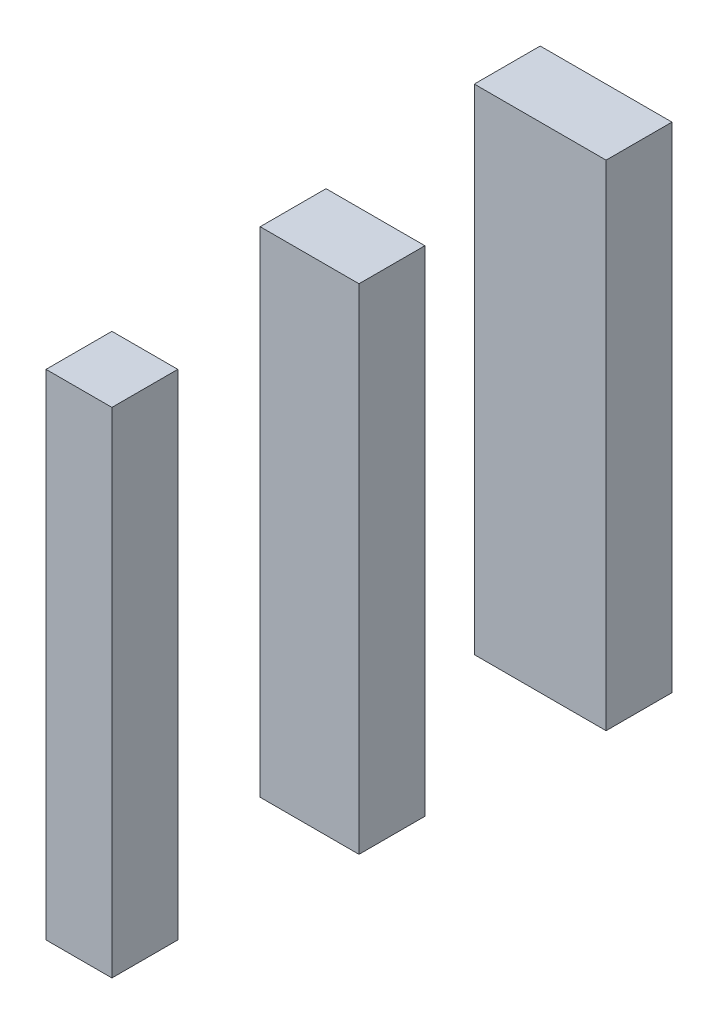
ISO-10303-21;
HEADER;
FILE_DESCRIPTION(('STEP AP214'),'2;1');
FILE_NAME('part.step','',(''),(''),'','','');
FILE_SCHEMA(('AUTOMOTIVE_DESIGN { 1 0 10303 214 1 1 1 1 }'));
ENDSEC;
DATA;
#1=APPLICATION_CONTEXT('core data for automotive mechanical design processes');
#2=APPLICATION_PROTOCOL_DEFINITION('international standard','automotive_design',2000,#1);
#3=PRODUCT_CONTEXT('',#1,'mechanical');
#4=PRODUCT('Part','Part','',(#3));
#5=PRODUCT_RELATED_PRODUCT_CATEGORY('part','',(#4));
#6=PRODUCT_DEFINITION_FORMATION('','',#4);
#7=PRODUCT_DEFINITION_CONTEXT('part definition',#1,'design');
#8=PRODUCT_DEFINITION('design','',#6,#7);
#9=PRODUCT_DEFINITION_SHAPE('','',#8);
#10=(LENGTH_UNIT() NAMED_UNIT(*) SI_UNIT(.MILLI.,.METRE.));
#11=(NAMED_UNIT(*) PLANE_ANGLE_UNIT() SI_UNIT($,.RADIAN.));
#12=(NAMED_UNIT(*) SI_UNIT($,.STERADIAN.) SOLID_ANGLE_UNIT());
#13=UNCERTAINTY_MEASURE_WITH_UNIT(LENGTH_MEASURE(1.E-05),#10,'distance_accuracy_value','');
#14=(GEOMETRIC_REPRESENTATION_CONTEXT(3) GLOBAL_UNCERTAINTY_ASSIGNED_CONTEXT((#13)) GLOBAL_UNIT_ASSIGNED_CONTEXT((#10,
#11,#12)) REPRESENTATION_CONTEXT('',''));
#15=CARTESIAN_POINT('',(0.,0.,0.));
#16=DIRECTION('',(0.,0.,1.));
#17=DIRECTION('',(1.,0.,0.));
#18=AXIS2_PLACEMENT_3D('',#15,#16,#17);
#19=CARTESIAN_POINT('',(-4.,31.,-16.));
#20=DIRECTION('',(1.,0.,0.));
#21=DIRECTION('',(0.,0.,-1.));
#22=AXIS2_PLACEMENT_3D('',#19,#20,#21);
#23=PLANE('',#22);
#24=DIRECTION('',(0.,0.,1.));
#25=VECTOR('',#24,1.);
#26=CARTESIAN_POINT('',(-4.,1.,-16.));
#27=LINE('',#26,#25);
#28=CARTESIAN_POINT('',(-4.,1.,-16.));
#29=VERTEX_POINT('',#28);
#30=CARTESIAN_POINT('',(-4.,1.,-12.));
#31=VERTEX_POINT('',#30);
#32=EDGE_CURVE('E107',#29,#31,#27,.T.);
#33=ORIENTED_EDGE('',*,*,#32,.T.);
#34=DIRECTION('',(0.,-1.,0.));
#35=VECTOR('',#34,1.);
#36=CARTESIAN_POINT('',(-4.,31.,-12.));
#37=LINE('',#36,#35);
#38=CARTESIAN_POINT('',(-4.,31.,-12.));
#39=VERTEX_POINT('',#38);
#40=EDGE_CURVE('E12',#39,#31,#37,.T.);
#41=ORIENTED_EDGE('',*,*,#40,.F.);
#42=DIRECTION('',(0.,0.,1.));
#43=VECTOR('',#42,1.);
#44=CARTESIAN_POINT('',(-4.,31.,-16.));
#45=LINE('',#44,#43);
#46=CARTESIAN_POINT('',(-4.,31.,-16.));
#47=VERTEX_POINT('',#46);
#48=EDGE_CURVE('E95',#47,#39,#45,.T.);
#49=ORIENTED_EDGE('',*,*,#48,.F.);
#50=DIRECTION('',(0.,-1.,0.));
#51=VECTOR('',#50,1.);
#52=CARTESIAN_POINT('',(-4.,31.,-16.));
#53=LINE('',#52,#51);
#54=EDGE_CURVE('E103',#47,#29,#53,.T.);
#55=ORIENTED_EDGE('',*,*,#54,.T.);
#56=EDGE_LOOP('',(#33,#41,#49,#55));
#57=FACE_BOUND('',#56,.T.);
#58=ADVANCED_FACE('F44',(#57),#23,.F.);
#59=CARTESIAN_POINT('',(-4.,31.,-12.));
#60=DIRECTION('',(0.,0.,-1.));
#61=DIRECTION('',(-1.,0.,0.));
#62=AXIS2_PLACEMENT_3D('',#59,#60,#61);
#63=PLANE('',#62);
#64=DIRECTION('',(1.,0.,0.));
#65=VECTOR('',#64,1.);
#66=CARTESIAN_POINT('',(-4.,1.,-12.));
#67=LINE('',#66,#65);
#68=CARTESIAN_POINT('',(4.,1.,-12.));
#69=VERTEX_POINT('',#68);
#70=EDGE_CURVE('E99',#31,#69,#67,.T.);
#71=ORIENTED_EDGE('',*,*,#70,.T.);
#72=DIRECTION('',(0.,-1.,0.));
#73=VECTOR('',#72,1.);
#74=CARTESIAN_POINT('',(4.,31.,-12.));
#75=LINE('',#74,#73);
#76=CARTESIAN_POINT('',(4.,31.,-12.));
#77=VERTEX_POINT('',#76);
#78=EDGE_CURVE('E52',#77,#69,#75,.T.);
#79=ORIENTED_EDGE('',*,*,#78,.F.);
#80=DIRECTION('',(1.,0.,0.));
#81=VECTOR('',#80,1.);
#82=CARTESIAN_POINT('',(-4.,31.,-12.));
#83=LINE('',#82,#81);
#84=EDGE_CURVE('E90',#39,#77,#83,.T.);
#85=ORIENTED_EDGE('',*,*,#84,.F.);
#86=ORIENTED_EDGE('',*,*,#40,.T.);
#87=EDGE_LOOP('',(#71,#79,#85,#86));
#88=FACE_BOUND('',#87,.T.);
#89=ADVANCED_FACE('F98',(#88),#63,.F.);
#90=CARTESIAN_POINT('',(4.,31.,-16.));
#91=DIRECTION('',(-1.,0.,0.));
#92=DIRECTION('',(0.,0.,1.));
#93=AXIS2_PLACEMENT_3D('',#90,#91,#92);
#94=PLANE('',#93);
#95=DIRECTION('',(0.,0.,-1.));
#96=VECTOR('',#95,1.);
#97=CARTESIAN_POINT('',(4.,1.,-16.));
#98=LINE('',#97,#96);
#99=CARTESIAN_POINT('',(4.,1.,-16.));
#100=VERTEX_POINT('',#99);
#101=EDGE_CURVE('E77',#69,#100,#98,.T.);
#102=ORIENTED_EDGE('',*,*,#101,.T.);
#103=DIRECTION('',(0.,-1.,0.));
#104=VECTOR('',#103,1.);
#105=CARTESIAN_POINT('',(4.,31.,-16.));
#106=LINE('',#105,#104);
#107=CARTESIAN_POINT('',(4.,31.,-16.));
#108=VERTEX_POINT('',#107);
#109=EDGE_CURVE('E100',#108,#100,#106,.T.);
#110=ORIENTED_EDGE('',*,*,#109,.F.);
#111=DIRECTION('',(0.,0.,-1.));
#112=VECTOR('',#111,1.);
#113=CARTESIAN_POINT('',(4.,31.,-16.));
#114=LINE('',#113,#112);
#115=EDGE_CURVE('E93',#77,#108,#114,.T.);
#116=ORIENTED_EDGE('',*,*,#115,.F.);
#117=ORIENTED_EDGE('',*,*,#78,.T.);
#118=EDGE_LOOP('',(#102,#110,#116,#117));
#119=FACE_BOUND('',#118,.T.);
#120=ADVANCED_FACE('F101',(#119),#94,.F.);
#121=CARTESIAN_POINT('',(-4.,31.,-16.));
#122=DIRECTION('',(0.,0.,1.));
#123=DIRECTION('',(1.,0.,0.));
#124=AXIS2_PLACEMENT_3D('',#121,#122,#123);
#125=PLANE('',#124);
#126=DIRECTION('',(-1.,0.,0.));
#127=VECTOR('',#126,1.);
#128=CARTESIAN_POINT('',(-4.,1.,-16.));
#129=LINE('',#128,#127);
#130=EDGE_CURVE('E83',#100,#29,#129,.T.);
#131=ORIENTED_EDGE('',*,*,#130,.T.);
#132=ORIENTED_EDGE('',*,*,#54,.F.);
#133=DIRECTION('',(-1.,0.,0.));
#134=VECTOR('',#133,1.);
#135=CARTESIAN_POINT('',(-4.,31.,-16.));
#136=LINE('',#135,#134);
#137=EDGE_CURVE('E60',#108,#47,#136,.T.);
#138=ORIENTED_EDGE('',*,*,#137,.F.);
#139=ORIENTED_EDGE('',*,*,#109,.T.);
#140=EDGE_LOOP('',(#131,#132,#138,#139));
#141=FACE_BOUND('',#140,.T.);
#142=ADVANCED_FACE('F114',(#141),#125,.F.);
#143=CARTESIAN_POINT('',(0.,31.,0.));
#144=DIRECTION('',(0.,1.,0.));
#145=DIRECTION('',(0.,0.,1.));
#146=AXIS2_PLACEMENT_3D('',#143,#144,#145);
#147=PLANE('',#146);
#148=ORIENTED_EDGE('',*,*,#48,.T.);
#149=ORIENTED_EDGE('',*,*,#84,.T.);
#150=ORIENTED_EDGE('',*,*,#115,.T.);
#151=ORIENTED_EDGE('',*,*,#137,.T.);
#152=EDGE_LOOP('',(#148,#149,#150,#151));
#153=FACE_BOUND('',#152,.T.);
#154=ADVANCED_FACE('F91',(#153),#147,.T.);
#155=CARTESIAN_POINT('',(0.,1.,0.));
#156=DIRECTION('',(0.,1.,0.));
#157=DIRECTION('',(0.,0.,1.));
#158=AXIS2_PLACEMENT_3D('',#155,#156,#157);
#159=PLANE('',#158);
#160=ORIENTED_EDGE('',*,*,#32,.F.);
#161=ORIENTED_EDGE('',*,*,#130,.F.);
#162=ORIENTED_EDGE('',*,*,#101,.F.);
#163=ORIENTED_EDGE('',*,*,#70,.F.);
#164=EDGE_LOOP('',(#160,#161,#162,#163));
#165=FACE_BOUND('',#164,.T.);
#166=ADVANCED_FACE('F117',(#165),#159,.F.);
#167=CLOSED_SHELL('',(#58,#89,#120,#142,#154,#166));
#168=MANIFOLD_SOLID_BREP('B2',#167);
#169=CARTESIAN_POINT('',(-3.,31.,-2.));
#170=DIRECTION('',(1.,0.,0.));
#171=DIRECTION('',(0.,0.,-1.));
#172=AXIS2_PLACEMENT_3D('',#169,#170,#171);
#173=PLANE('',#172);
#174=DIRECTION('',(0.,0.,1.));
#175=VECTOR('',#174,1.);
#176=CARTESIAN_POINT('',(-3.,1.,-2.));
#177=LINE('',#176,#175);
#178=CARTESIAN_POINT('',(-3.,1.,-2.));
#179=VERTEX_POINT('',#178);
#180=CARTESIAN_POINT('',(-3.,1.,2.));
#181=VERTEX_POINT('',#180);
#182=EDGE_CURVE('E240',#179,#181,#177,.T.);
#183=ORIENTED_EDGE('',*,*,#182,.T.);
#184=DIRECTION('',(0.,-1.,0.));
#185=VECTOR('',#184,1.);
#186=CARTESIAN_POINT('',(-3.,31.,2.));
#187=LINE('',#186,#185);
#188=CARTESIAN_POINT('',(-3.,31.,2.));
#189=VERTEX_POINT('',#188);
#190=EDGE_CURVE('E42',#189,#181,#187,.T.);
#191=ORIENTED_EDGE('',*,*,#190,.F.);
#192=DIRECTION('',(0.,0.,1.));
#193=VECTOR('',#192,1.);
#194=CARTESIAN_POINT('',(-3.,31.,-2.));
#195=LINE('',#194,#193);
#196=CARTESIAN_POINT('',(-3.,31.,-2.));
#197=VERTEX_POINT('',#196);
#198=EDGE_CURVE('E228',#197,#189,#195,.T.);
#199=ORIENTED_EDGE('',*,*,#198,.F.);
#200=DIRECTION('',(0.,-1.,0.));
#201=VECTOR('',#200,1.);
#202=CARTESIAN_POINT('',(-3.,31.,-2.));
#203=LINE('',#202,#201);
#204=EDGE_CURVE('E236',#197,#179,#203,.T.);
#205=ORIENTED_EDGE('',*,*,#204,.T.);
#206=EDGE_LOOP('',(#183,#191,#199,#205));
#207=FACE_BOUND('',#206,.T.);
#208=ADVANCED_FACE('F177',(#207),#173,.F.);
#209=CARTESIAN_POINT('',(-3.,31.,2.));
#210=DIRECTION('',(0.,0.,-1.));
#211=DIRECTION('',(-1.,0.,0.));
#212=AXIS2_PLACEMENT_3D('',#209,#210,#211);
#213=PLANE('',#212);
#214=DIRECTION('',(1.,0.,0.));
#215=VECTOR('',#214,1.);
#216=CARTESIAN_POINT('',(-3.,1.,2.));
#217=LINE('',#216,#215);
#218=CARTESIAN_POINT('',(3.,1.,2.));
#219=VERTEX_POINT('',#218);
#220=EDGE_CURVE('E232',#181,#219,#217,.T.);
#221=ORIENTED_EDGE('',*,*,#220,.T.);
#222=DIRECTION('',(0.,-1.,0.));
#223=VECTOR('',#222,1.);
#224=CARTESIAN_POINT('',(3.,31.,2.));
#225=LINE('',#224,#223);
#226=CARTESIAN_POINT('',(3.,31.,2.));
#227=VERTEX_POINT('',#226);
#228=EDGE_CURVE('E185',#227,#219,#225,.T.);
#229=ORIENTED_EDGE('',*,*,#228,.F.);
#230=DIRECTION('',(1.,0.,0.));
#231=VECTOR('',#230,1.);
#232=CARTESIAN_POINT('',(-3.,31.,2.));
#233=LINE('',#232,#231);
#234=EDGE_CURVE('E223',#189,#227,#233,.T.);
#235=ORIENTED_EDGE('',*,*,#234,.F.);
#236=ORIENTED_EDGE('',*,*,#190,.T.);
#237=EDGE_LOOP('',(#221,#229,#235,#236));
#238=FACE_BOUND('',#237,.T.);
#239=ADVANCED_FACE('F231',(#238),#213,.F.);
#240=CARTESIAN_POINT('',(3.,31.,-2.));
#241=DIRECTION('',(-1.,0.,0.));
#242=DIRECTION('',(0.,0.,1.));
#243=AXIS2_PLACEMENT_3D('',#240,#241,#242);
#244=PLANE('',#243);
#245=DIRECTION('',(0.,0.,-1.));
#246=VECTOR('',#245,1.);
#247=CARTESIAN_POINT('',(3.,1.,-2.));
#248=LINE('',#247,#246);
#249=CARTESIAN_POINT('',(3.,1.,-2.));
#250=VERTEX_POINT('',#249);
#251=EDGE_CURVE('E210',#219,#250,#248,.T.);
#252=ORIENTED_EDGE('',*,*,#251,.T.);
#253=DIRECTION('',(0.,-1.,0.));
#254=VECTOR('',#253,1.);
#255=CARTESIAN_POINT('',(3.,31.,-2.));
#256=LINE('',#255,#254);
#257=CARTESIAN_POINT('',(3.,31.,-2.));
#258=VERTEX_POINT('',#257);
#259=EDGE_CURVE('E233',#258,#250,#256,.T.);
#260=ORIENTED_EDGE('',*,*,#259,.F.);
#261=DIRECTION('',(0.,0.,-1.));
#262=VECTOR('',#261,1.);
#263=CARTESIAN_POINT('',(3.,31.,-2.));
#264=LINE('',#263,#262);
#265=EDGE_CURVE('E226',#227,#258,#264,.T.);
#266=ORIENTED_EDGE('',*,*,#265,.F.);
#267=ORIENTED_EDGE('',*,*,#228,.T.);
#268=EDGE_LOOP('',(#252,#260,#266,#267));
#269=FACE_BOUND('',#268,.T.);
#270=ADVANCED_FACE('F234',(#269),#244,.F.);
#271=CARTESIAN_POINT('',(-3.,31.,-2.));
#272=DIRECTION('',(0.,0.,1.));
#273=DIRECTION('',(1.,0.,0.));
#274=AXIS2_PLACEMENT_3D('',#271,#272,#273);
#275=PLANE('',#274);
#276=DIRECTION('',(-1.,0.,0.));
#277=VECTOR('',#276,1.);
#278=CARTESIAN_POINT('',(-3.,1.,-2.));
#279=LINE('',#278,#277);
#280=EDGE_CURVE('E216',#250,#179,#279,.T.);
#281=ORIENTED_EDGE('',*,*,#280,.T.);
#282=ORIENTED_EDGE('',*,*,#204,.F.);
#283=DIRECTION('',(-1.,0.,0.));
#284=VECTOR('',#283,1.);
#285=CARTESIAN_POINT('',(-3.,31.,-2.));
#286=LINE('',#285,#284);
#287=EDGE_CURVE('E193',#258,#197,#286,.T.);
#288=ORIENTED_EDGE('',*,*,#287,.F.);
#289=ORIENTED_EDGE('',*,*,#259,.T.);
#290=EDGE_LOOP('',(#281,#282,#288,#289));
#291=FACE_BOUND('',#290,.T.);
#292=ADVANCED_FACE('F247',(#291),#275,.F.);
#293=CARTESIAN_POINT('',(0.,31.,0.));
#294=DIRECTION('',(0.,1.,0.));
#295=DIRECTION('',(0.,0.,1.));
#296=AXIS2_PLACEMENT_3D('',#293,#294,#295);
#297=PLANE('',#296);
#298=ORIENTED_EDGE('',*,*,#198,.T.);
#299=ORIENTED_EDGE('',*,*,#234,.T.);
#300=ORIENTED_EDGE('',*,*,#265,.T.);
#301=ORIENTED_EDGE('',*,*,#287,.T.);
#302=EDGE_LOOP('',(#298,#299,#300,#301));
#303=FACE_BOUND('',#302,.T.);
#304=ADVANCED_FACE('F224',(#303),#297,.T.);
#305=CARTESIAN_POINT('',(0.,1.,0.));
#306=DIRECTION('',(0.,1.,0.));
#307=DIRECTION('',(0.,0.,1.));
#308=AXIS2_PLACEMENT_3D('',#305,#306,#307);
#309=PLANE('',#308);
#310=ORIENTED_EDGE('',*,*,#182,.F.);
#311=ORIENTED_EDGE('',*,*,#280,.F.);
#312=ORIENTED_EDGE('',*,*,#251,.F.);
#313=ORIENTED_EDGE('',*,*,#220,.F.);
#314=EDGE_LOOP('',(#310,#311,#312,#313));
#315=FACE_BOUND('',#314,.T.);
#316=ADVANCED_FACE('F250',(#315),#309,.F.);
#317=CLOSED_SHELL('',(#208,#239,#270,#292,#304,#316));
#318=MANIFOLD_SOLID_BREP('B6',#317);
#319=CARTESIAN_POINT('',(-2.,31.,12.));
#320=DIRECTION('',(1.,0.,0.));
#321=DIRECTION('',(0.,0.,-1.));
#322=AXIS2_PLACEMENT_3D('',#319,#320,#321);
#323=PLANE('',#322);
#324=DIRECTION('',(0.,0.,1.));
#325=VECTOR('',#324,1.);
#326=CARTESIAN_POINT('',(-2.,1.,12.));
#327=LINE('',#326,#325);
#328=CARTESIAN_POINT('',(-2.,1.,12.));
#329=VERTEX_POINT('',#328);
#330=CARTESIAN_POINT('',(-2.,1.,16.));
#331=VERTEX_POINT('',#330);
#332=EDGE_CURVE('E364',#329,#331,#327,.T.);
#333=ORIENTED_EDGE('',*,*,#332,.T.);
#334=DIRECTION('',(0.,-1.,0.));
#335=VECTOR('',#334,1.);
#336=CARTESIAN_POINT('',(-2.,31.,16.));
#337=LINE('',#336,#335);
#338=CARTESIAN_POINT('',(-2.,31.,16.));
#339=VERTEX_POINT('',#338);
#340=EDGE_CURVE('E175',#339,#331,#337,.T.);
#341=ORIENTED_EDGE('',*,*,#340,.F.);
#342=DIRECTION('',(0.,0.,1.));
#343=VECTOR('',#342,1.);
#344=CARTESIAN_POINT('',(-2.,31.,12.));
#345=LINE('',#344,#343);
#346=CARTESIAN_POINT('',(-2.,31.,12.));
#347=VERTEX_POINT('',#346);
#348=EDGE_CURVE('E352',#347,#339,#345,.T.);
#349=ORIENTED_EDGE('',*,*,#348,.F.);
#350=DIRECTION('',(0.,-1.,0.));
#351=VECTOR('',#350,1.);
#352=CARTESIAN_POINT('',(-2.,31.,12.));
#353=LINE('',#352,#351);
#354=EDGE_CURVE('E360',#347,#329,#353,.T.);
#355=ORIENTED_EDGE('',*,*,#354,.T.);
#356=EDGE_LOOP('',(#333,#341,#349,#355));
#357=FACE_BOUND('',#356,.T.);
#358=ADVANCED_FACE('F301',(#357),#323,.F.);
#359=CARTESIAN_POINT('',(-2.,31.,16.));
#360=DIRECTION('',(0.,0.,-1.));
#361=DIRECTION('',(-1.,0.,0.));
#362=AXIS2_PLACEMENT_3D('',#359,#360,#361);
#363=PLANE('',#362);
#364=DIRECTION('',(1.,0.,0.));
#365=VECTOR('',#364,1.);
#366=CARTESIAN_POINT('',(-2.,1.,16.));
#367=LINE('',#366,#365);
#368=CARTESIAN_POINT('',(2.,1.,16.));
#369=VERTEX_POINT('',#368);
#370=EDGE_CURVE('E356',#331,#369,#367,.T.);
#371=ORIENTED_EDGE('',*,*,#370,.T.);
#372=DIRECTION('',(0.,-1.,0.));
#373=VECTOR('',#372,1.);
#374=CARTESIAN_POINT('',(2.,31.,16.));
#375=LINE('',#374,#373);
#376=CARTESIAN_POINT('',(2.,31.,16.));
#377=VERTEX_POINT('',#376);
#378=EDGE_CURVE('E309',#377,#369,#375,.T.);
#379=ORIENTED_EDGE('',*,*,#378,.F.);
#380=DIRECTION('',(1.,0.,0.));
#381=VECTOR('',#380,1.);
#382=CARTESIAN_POINT('',(-2.,31.,16.));
#383=LINE('',#382,#381);
#384=EDGE_CURVE('E347',#339,#377,#383,.T.);
#385=ORIENTED_EDGE('',*,*,#384,.F.);
#386=ORIENTED_EDGE('',*,*,#340,.T.);
#387=EDGE_LOOP('',(#371,#379,#385,#386));
#388=FACE_BOUND('',#387,.T.);
#389=ADVANCED_FACE('F355',(#388),#363,.F.);
#390=CARTESIAN_POINT('',(2.,31.,12.));
#391=DIRECTION('',(-1.,0.,0.));
#392=DIRECTION('',(0.,0.,1.));
#393=AXIS2_PLACEMENT_3D('',#390,#391,#392);
#394=PLANE('',#393);
#395=DIRECTION('',(0.,0.,-1.));
#396=VECTOR('',#395,1.);
#397=CARTESIAN_POINT('',(2.,1.,12.));
#398=LINE('',#397,#396);
#399=CARTESIAN_POINT('',(2.,1.,12.));
#400=VERTEX_POINT('',#399);
#401=EDGE_CURVE('E334',#369,#400,#398,.T.);
#402=ORIENTED_EDGE('',*,*,#401,.T.);
#403=DIRECTION('',(0.,-1.,0.));
#404=VECTOR('',#403,1.);
#405=CARTESIAN_POINT('',(2.,31.,12.));
#406=LINE('',#405,#404);
#407=CARTESIAN_POINT('',(2.,31.,12.));
#408=VERTEX_POINT('',#407);
#409=EDGE_CURVE('E357',#408,#400,#406,.T.);
#410=ORIENTED_EDGE('',*,*,#409,.F.);
#411=DIRECTION('',(0.,0.,-1.));
#412=VECTOR('',#411,1.);
#413=CARTESIAN_POINT('',(2.,31.,12.));
#414=LINE('',#413,#412);
#415=EDGE_CURVE('E350',#377,#408,#414,.T.);
#416=ORIENTED_EDGE('',*,*,#415,.F.);
#417=ORIENTED_EDGE('',*,*,#378,.T.);
#418=EDGE_LOOP('',(#402,#410,#416,#417));
#419=FACE_BOUND('',#418,.T.);
#420=ADVANCED_FACE('F358',(#419),#394,.F.);
#421=CARTESIAN_POINT('',(-2.,31.,12.));
#422=DIRECTION('',(0.,0.,1.));
#423=DIRECTION('',(1.,0.,0.));
#424=AXIS2_PLACEMENT_3D('',#421,#422,#423);
#425=PLANE('',#424);
#426=DIRECTION('',(-1.,0.,0.));
#427=VECTOR('',#426,1.);
#428=CARTESIAN_POINT('',(-2.,1.,12.));
#429=LINE('',#428,#427);
#430=EDGE_CURVE('E340',#400,#329,#429,.T.);
#431=ORIENTED_EDGE('',*,*,#430,.T.);
#432=ORIENTED_EDGE('',*,*,#354,.F.);
#433=DIRECTION('',(-1.,0.,0.));
#434=VECTOR('',#433,1.);
#435=CARTESIAN_POINT('',(-2.,31.,12.));
#436=LINE('',#435,#434);
#437=EDGE_CURVE('E317',#408,#347,#436,.T.);
#438=ORIENTED_EDGE('',*,*,#437,.F.);
#439=ORIENTED_EDGE('',*,*,#409,.T.);
#440=EDGE_LOOP('',(#431,#432,#438,#439));
#441=FACE_BOUND('',#440,.T.);
#442=ADVANCED_FACE('F371',(#441),#425,.F.);
#443=CARTESIAN_POINT('',(0.,31.,0.));
#444=DIRECTION('',(0.,1.,0.));
#445=DIRECTION('',(0.,0.,1.));
#446=AXIS2_PLACEMENT_3D('',#443,#444,#445);
#447=PLANE('',#446);
#448=ORIENTED_EDGE('',*,*,#348,.T.);
#449=ORIENTED_EDGE('',*,*,#384,.T.);
#450=ORIENTED_EDGE('',*,*,#415,.T.);
#451=ORIENTED_EDGE('',*,*,#437,.T.);
#452=EDGE_LOOP('',(#448,#449,#450,#451));
#453=FACE_BOUND('',#452,.T.);
#454=ADVANCED_FACE('F348',(#453),#447,.T.);
#455=CARTESIAN_POINT('',(0.,1.,0.));
#456=DIRECTION('',(0.,1.,0.));
#457=DIRECTION('',(0.,0.,1.));
#458=AXIS2_PLACEMENT_3D('',#455,#456,#457);
#459=PLANE('',#458);
#460=ORIENTED_EDGE('',*,*,#332,.F.);
#461=ORIENTED_EDGE('',*,*,#430,.F.);
#462=ORIENTED_EDGE('',*,*,#401,.F.);
#463=ORIENTED_EDGE('',*,*,#370,.F.);
#464=EDGE_LOOP('',(#460,#461,#462,#463));
#465=FACE_BOUND('',#464,.T.);
#466=ADVANCED_FACE('F374',(#465),#459,.F.);
#467=CLOSED_SHELL('',(#358,#389,#420,#442,#454,#466));
#468=MANIFOLD_SOLID_BREP('B36',#467);
#469=ADVANCED_BREP_SHAPE_REPRESENTATION('',(#18,#168,#318,#468),#14);
#470=SHAPE_DEFINITION_REPRESENTATION(#9,#469);
ENDSEC;
END-ISO-10303-21;
